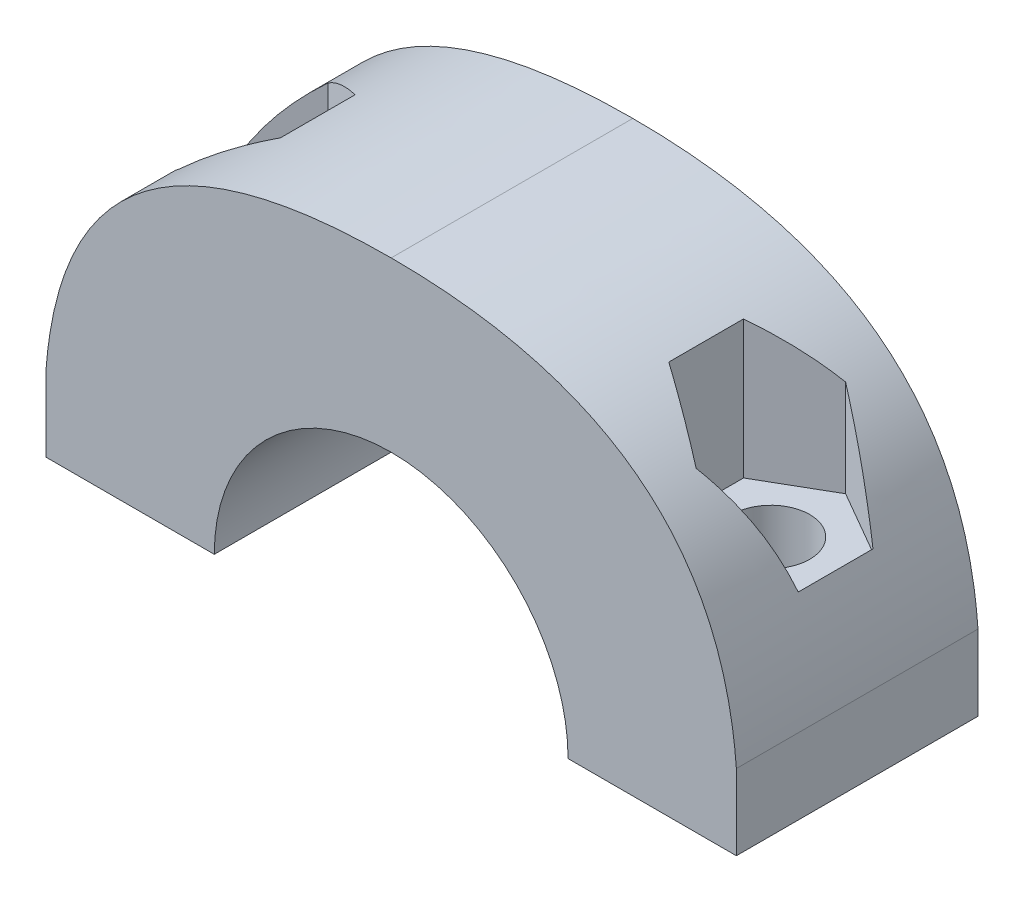
ISO-10303-21;
HEADER;
FILE_DESCRIPTION(('STEP AP214'),'2;1');
FILE_NAME('part.step','',(''),(''),'','','');
FILE_SCHEMA(('AUTOMOTIVE_DESIGN { 1 0 10303 214 1 1 1 1 }'));
ENDSEC;
DATA;
#1=APPLICATION_CONTEXT('core data for automotive mechanical design processes');
#2=APPLICATION_PROTOCOL_DEFINITION('international standard','automotive_design',2000,#1);
#3=PRODUCT_CONTEXT('',#1,'mechanical');
#4=PRODUCT('Part','Part','',(#3));
#5=PRODUCT_RELATED_PRODUCT_CATEGORY('part','',(#4));
#6=PRODUCT_DEFINITION_FORMATION('','',#4);
#7=PRODUCT_DEFINITION_CONTEXT('part definition',#1,'design');
#8=PRODUCT_DEFINITION('design','',#6,#7);
#9=PRODUCT_DEFINITION_SHAPE('','',#8);
#10=(LENGTH_UNIT() NAMED_UNIT(*) SI_UNIT(.MILLI.,.METRE.));
#11=(NAMED_UNIT(*) PLANE_ANGLE_UNIT() SI_UNIT($,.RADIAN.));
#12=(NAMED_UNIT(*) SI_UNIT($,.STERADIAN.) SOLID_ANGLE_UNIT());
#13=UNCERTAINTY_MEASURE_WITH_UNIT(LENGTH_MEASURE(1.E-05),#10,'distance_accuracy_value','');
#14=(GEOMETRIC_REPRESENTATION_CONTEXT(3) GLOBAL_UNCERTAINTY_ASSIGNED_CONTEXT((#13)) GLOBAL_UNIT_ASSIGNED_CONTEXT((#10,
#11,#12)) REPRESENTATION_CONTEXT('',''));
#15=CARTESIAN_POINT('',(0.,0.,0.));
#16=DIRECTION('',(0.,0.,1.));
#17=DIRECTION('',(1.,0.,0.));
#18=AXIS2_PLACEMENT_3D('',#15,#16,#17);
#19=CARTESIAN_POINT('',(-15.,35.,0.));
#20=DIRECTION('',(0.,-1.,0.));
#21=DIRECTION('',(1.,0.,0.));
#22=AXIS2_PLACEMENT_3D('',#19,#20,#21);
#23=CYLINDRICAL_SURFACE('',#22,2.25);
#24=CARTESIAN_POINT('',(-15.,0.,0.));
#25=DIRECTION('',(0.,-1.,0.));
#26=DIRECTION('',(-1.,0.,0.));
#27=AXIS2_PLACEMENT_3D('',#24,#25,#26);
#28=CIRCLE('',#27,2.25);
#29=CARTESIAN_POINT('',(-17.25,0.,0.));
#30=VERTEX_POINT('',#29);
#31=EDGE_CURVE('E387',#30,#30,#28,.T.);
#32=ORIENTED_EDGE('',*,*,#31,.T.);
#33=EDGE_LOOP('',(#32));
#34=FACE_BOUND('',#33,.T.);
#35=CARTESIAN_POINT('',(-15.,10.,0.));
#36=DIRECTION('',(0.,1.,0.));
#37=DIRECTION('',(0.,0.,1.));
#38=AXIS2_PLACEMENT_3D('',#35,#36,#37);
#39=CIRCLE('',#38,2.25);
#40=CARTESIAN_POINT('',(-15.,10.,2.25));
#41=VERTEX_POINT('',#40);
#42=EDGE_CURVE('E384',#41,#41,#39,.F.);
#43=ORIENTED_EDGE('',*,*,#42,.F.);
#44=EDGE_LOOP('',(#43));
#45=FACE_BOUND('',#44,.T.);
#46=ADVANCED_FACE('F43',(#34,#45),#23,.F.);
#47=CARTESIAN_POINT('',(-20.,0.,7.));
#48=DIRECTION('',(1.,0.,0.));
#49=DIRECTION('',(0.,0.,-1.));
#50=AXIS2_PLACEMENT_3D('',#47,#48,#49);
#51=PLANE('',#50);
#52=DIRECTION('',(0.,0.,1.));
#53=VECTOR('',#52,1.);
#54=CARTESIAN_POINT('',(-20.,4.37823737090322,-7.001));
#55=LINE('',#54,#53);
#56=CARTESIAN_POINT('',(-20.,4.37823737090322,-7.));
#57=VERTEX_POINT('',#56);
#58=CARTESIAN_POINT('',(-20.,4.37823737090322,7.));
#59=VERTEX_POINT('',#58);
#60=EDGE_CURVE('E71',#57,#59,#55,.T.);
#61=ORIENTED_EDGE('',*,*,#60,.F.);
#62=DIRECTION('',(0.,-1.,0.));
#63=VECTOR('',#62,1.);
#64=CARTESIAN_POINT('',(-20.,0.,-7.));
#65=LINE('',#64,#63);
#66=CARTESIAN_POINT('',(-20.,0.,-7.));
#67=VERTEX_POINT('',#66);
#68=EDGE_CURVE('E378',#57,#67,#65,.T.);
#69=ORIENTED_EDGE('',*,*,#68,.T.);
#70=DIRECTION('',(0.,0.,1.));
#71=VECTOR('',#70,1.);
#72=CARTESIAN_POINT('',(-20.,0.,-9.82842712474619));
#73=LINE('',#72,#71);
#74=CARTESIAN_POINT('',(-20.,0.,7.));
#75=VERTEX_POINT('',#74);
#76=EDGE_CURVE('E207',#67,#75,#73,.T.);
#77=ORIENTED_EDGE('',*,*,#76,.T.);
#78=DIRECTION('',(0.,-1.,0.));
#79=VECTOR('',#78,1.);
#80=CARTESIAN_POINT('',(-20.,0.,7.));
#81=LINE('',#80,#79);
#82=EDGE_CURVE('E374',#59,#75,#81,.T.);
#83=ORIENTED_EDGE('',*,*,#82,.F.);
#84=EDGE_LOOP('',(#61,#69,#77,#83));
#85=FACE_BOUND('',#84,.T.);
#86=ADVANCED_FACE('F45',(#85),#51,.F.);
#87=CARTESIAN_POINT('',(0.,0.,-7.));
#88=DIRECTION('',(0.,0.,1.));
#89=DIRECTION('',(1.,0.,0.));
#90=AXIS2_PLACEMENT_3D('',#87,#88,#89);
#91=PLANE('',#90);
#92=CARTESIAN_POINT('',(0.,20.,-7.));
#93=CARTESIAN_POINT('',(-21.3364589510658,20.,-7.));
#94=CARTESIAN_POINT('',(-20.,-0.0763553500838322,-7.));
#95=B_SPLINE_CURVE_WITH_KNOTS('',2,(#92,#93,#94),.UNSPECIFIED.,.F.,.F.,(3,3),(0.,1.),.UNSPECIFIED.);
#96=CARTESIAN_POINT('',(0.,20.,-7.));
#97=VERTEX_POINT('',#96);
#98=EDGE_CURVE('E496',#57,#97,#95,.F.);
#99=ORIENTED_EDGE('',*,*,#98,.T.);
#100=CARTESIAN_POINT('',(0.,20.,-7.));
#101=CARTESIAN_POINT('',(21.3364589510658,20.,-7.));
#102=CARTESIAN_POINT('',(20.,-0.0763553500838322,-7.));
#103=B_SPLINE_CURVE_WITH_KNOTS('',2,(#100,#101,#102),.UNSPECIFIED.,.F.,.F.,(3,3),(0.,1.),.UNSPECIFIED.);
#104=CARTESIAN_POINT('',(20.,4.37823737090339,-7.));
#105=VERTEX_POINT('',#104);
#106=EDGE_CURVE('E187',#97,#105,#103,.T.);
#107=ORIENTED_EDGE('',*,*,#106,.T.);
#108=DIRECTION('',(0.,1.,0.));
#109=VECTOR('',#108,1.);
#110=CARTESIAN_POINT('',(20.,0.,-7.));
#111=LINE('',#110,#109);
#112=CARTESIAN_POINT('',(20.,0.,-7.));
#113=VERTEX_POINT('',#112);
#114=EDGE_CURVE('E181',#113,#105,#111,.T.);
#115=ORIENTED_EDGE('',*,*,#114,.F.);
#116=DIRECTION('',(1.,0.,0.));
#117=VECTOR('',#116,1.);
#118=CARTESIAN_POINT('',(10.25,0.,-7.));
#119=LINE('',#118,#117);
#120=CARTESIAN_POINT('',(10.25,0.,-7.));
#121=VERTEX_POINT('',#120);
#122=EDGE_CURVE('E186',#121,#113,#119,.T.);
#123=ORIENTED_EDGE('',*,*,#122,.F.);
#124=CARTESIAN_POINT('',(0.,0.,-7.));
#125=DIRECTION('',(0.,0.,-1.));
#126=DIRECTION('',(1.,0.,0.));
#127=AXIS2_PLACEMENT_3D('',#124,#125,#126);
#128=CIRCLE('',#127,10.25);
#129=CARTESIAN_POINT('',(-10.25,0.,-7.));
#130=VERTEX_POINT('',#129);
#131=EDGE_CURVE('E372',#130,#121,#128,.T.);
#132=ORIENTED_EDGE('',*,*,#131,.F.);
#133=DIRECTION('',(1.,0.,0.));
#134=VECTOR('',#133,1.);
#135=CARTESIAN_POINT('',(-20.,0.,-7.));
#136=LINE('',#135,#134);
#137=EDGE_CURVE('E375',#67,#130,#136,.T.);
#138=ORIENTED_EDGE('',*,*,#137,.F.);
#139=ORIENTED_EDGE('',*,*,#68,.F.);
#140=EDGE_LOOP('',(#99,#107,#115,#123,#132,#138,#139));
#141=FACE_BOUND('',#140,.T.);
#142=ADVANCED_FACE('F184',(#141),#91,.F.);
#143=CARTESIAN_POINT('',(0.,0.,7.));
#144=DIRECTION('',(0.,0.,1.));
#145=DIRECTION('',(1.,0.,0.));
#146=AXIS2_PLACEMENT_3D('',#143,#144,#145);
#147=PLANE('',#146);
#148=CARTESIAN_POINT('',(0.,0.,7.));
#149=DIRECTION('',(0.,0.,-1.));
#150=DIRECTION('',(1.,0.,0.));
#151=AXIS2_PLACEMENT_3D('',#148,#149,#150);
#152=CIRCLE('',#151,10.25);
#153=CARTESIAN_POINT('',(-10.25,0.,7.));
#154=VERTEX_POINT('',#153);
#155=CARTESIAN_POINT('',(10.25,0.,7.));
#156=VERTEX_POINT('',#155);
#157=EDGE_CURVE('E363',#154,#156,#152,.T.);
#158=ORIENTED_EDGE('',*,*,#157,.T.);
#159=DIRECTION('',(1.,0.,0.));
#160=VECTOR('',#159,1.);
#161=CARTESIAN_POINT('',(10.25,0.,7.));
#162=LINE('',#161,#160);
#163=CARTESIAN_POINT('',(20.,0.,7.));
#164=VERTEX_POINT('',#163);
#165=EDGE_CURVE('E191',#156,#164,#162,.T.);
#166=ORIENTED_EDGE('',*,*,#165,.T.);
#167=DIRECTION('',(0.,1.,0.));
#168=VECTOR('',#167,1.);
#169=CARTESIAN_POINT('',(20.,0.,7.));
#170=LINE('',#169,#168);
#171=CARTESIAN_POINT('',(20.,4.37823737090339,7.));
#172=VERTEX_POINT('',#171);
#173=EDGE_CURVE('E206',#164,#172,#170,.T.);
#174=ORIENTED_EDGE('',*,*,#173,.T.);
#175=CARTESIAN_POINT('',(0.,20.,7.));
#176=CARTESIAN_POINT('',(21.3364589510658,20.,7.));
#177=CARTESIAN_POINT('',(20.,-0.0763553500838322,7.));
#178=B_SPLINE_CURVE_WITH_KNOTS('',2,(#175,#176,#177),.UNSPECIFIED.,.F.,.F.,(3,3),(0.,1.),.UNSPECIFIED.);
#179=CARTESIAN_POINT('',(0.,20.,7.));
#180=VERTEX_POINT('',#179);
#181=EDGE_CURVE('E251',#180,#172,#178,.T.);
#182=ORIENTED_EDGE('',*,*,#181,.F.);
#183=CARTESIAN_POINT('',(0.,20.,7.));
#184=CARTESIAN_POINT('',(-21.3364589510658,20.,7.));
#185=CARTESIAN_POINT('',(-20.,-0.0763553500838322,7.));
#186=B_SPLINE_CURVE_WITH_KNOTS('',2,(#183,#184,#185),.UNSPECIFIED.,.F.,.F.,(3,3),(0.,1.),.UNSPECIFIED.);
#187=EDGE_CURVE('E509',#180,#59,#186,.T.);
#188=ORIENTED_EDGE('',*,*,#187,.T.);
#189=ORIENTED_EDGE('',*,*,#82,.T.);
#190=DIRECTION('',(1.,0.,0.));
#191=VECTOR('',#190,1.);
#192=CARTESIAN_POINT('',(-20.,0.,7.));
#193=LINE('',#192,#191);
#194=EDGE_CURVE('E365',#75,#154,#193,.T.);
#195=ORIENTED_EDGE('',*,*,#194,.T.);
#196=EDGE_LOOP('',(#158,#166,#174,#182,#188,#189,#195));
#197=FACE_BOUND('',#196,.T.);
#198=ADVANCED_FACE('F361',(#197),#147,.T.);
#199=CARTESIAN_POINT('',(-20.,0.,7.));
#200=DIRECTION('',(0.,1.,0.));
#201=DIRECTION('',(-1.,0.,0.));
#202=AXIS2_PLACEMENT_3D('',#199,#200,#201);
#203=PLANE('',#202);
#204=ORIENTED_EDGE('',*,*,#31,.F.);
#205=EDGE_LOOP('',(#204));
#206=FACE_BOUND('',#205,.T.);
#207=ORIENTED_EDGE('',*,*,#194,.F.);
#208=ORIENTED_EDGE('',*,*,#76,.F.);
#209=ORIENTED_EDGE('',*,*,#137,.T.);
#210=DIRECTION('',(0.,0.,-1.));
#211=VECTOR('',#210,1.);
#212=CARTESIAN_POINT('',(-10.25,0.,7.));
#213=LINE('',#212,#211);
#214=EDGE_CURVE('E369',#154,#130,#213,.T.);
#215=ORIENTED_EDGE('',*,*,#214,.F.);
#216=EDGE_LOOP('',(#207,#208,#209,#215));
#217=FACE_BOUND('',#216,.T.);
#218=ADVANCED_FACE('F448',(#206,#217),#203,.F.);
#219=CARTESIAN_POINT('',(0.,0.,7.));
#220=DIRECTION('',(0.,0.,-1.));
#221=DIRECTION('',(-1.,0.,0.));
#222=AXIS2_PLACEMENT_3D('',#219,#220,#221);
#223=CYLINDRICAL_SURFACE('',#222,10.25);
#224=ORIENTED_EDGE('',*,*,#131,.T.);
#225=DIRECTION('',(0.,0.,-1.));
#226=VECTOR('',#225,1.);
#227=CARTESIAN_POINT('',(10.25,0.,7.));
#228=LINE('',#227,#226);
#229=EDGE_CURVE('E200',#156,#121,#228,.T.);
#230=ORIENTED_EDGE('',*,*,#229,.F.);
#231=ORIENTED_EDGE('',*,*,#157,.F.);
#232=ORIENTED_EDGE('',*,*,#214,.T.);
#233=EDGE_LOOP('',(#224,#230,#231,#232));
#234=FACE_BOUND('',#233,.T.);
#235=ADVANCED_FACE('F371',(#234),#223,.F.);
#236=CARTESIAN_POINT('',(0.,20.,-7.001));
#237=CARTESIAN_POINT('',(-21.3364589510658,20.,-7.001));
#238=CARTESIAN_POINT('',(-20.,-0.0763553500838322,-7.001));
#239=B_SPLINE_CURVE_WITH_KNOTS('',2,(#236,#237,#238),.UNSPECIFIED.,.F.,.F.,(3,3),(0.,1.),.UNSPECIFIED.);
#240=DIRECTION('',(0.,0.,1.));
#241=VECTOR('',#240,1.);
#242=SURFACE_OF_LINEAR_EXTRUSION('',#239,#241);
#243=CARTESIAN_POINT('',(-15.,15.6071851133788,4.3301270189222));
#244=CARTESIAN_POINT('',(-14.8854483036064,15.7074375849572,4.26399056617323));
#245=CARTESIAN_POINT('',(-14.7694756690178,15.8055158896841,4.19703373437486));
#246=CARTESIAN_POINT('',(-14.5352777899895,15.997038518228,4.06181952587421));
#247=CARTESIAN_POINT('',(-14.4170614002219,16.0904972742878,3.99356726141928));
#248=CARTESIAN_POINT('',(-14.1784751181328,16.2729522616809,3.85581940723017));
#249=CARTESIAN_POINT('',(-14.0581109358645,16.3619584585819,3.78632711419682));
#250=CARTESIAN_POINT('',(-13.8153212116759,16.5356750743019,3.64615240158001));
#251=CARTESIAN_POINT('',(-13.6928988912952,16.6203915005076,3.57547184195344));
#252=CARTESIAN_POINT('',(-13.4460798328883,16.7856846333991,3.43297079214104));
#253=CARTESIAN_POINT('',(-13.3216843777116,16.8662638962464,3.36115104260886));
#254=CARTESIAN_POINT('',(-13.0710706070805,17.0233868431527,3.21645911467235));
#255=CARTESIAN_POINT('',(-12.944853139303,17.0999323314104,3.14358742567459));
#256=CARTESIAN_POINT('',(-12.6905854561505,17.2491868299323,2.99678591036024));
#257=CARTESIAN_POINT('',(-12.5625336805988,17.3218922933087,2.92285518327525));
#258=CARTESIAN_POINT('',(-12.3046528343486,17.4636063500637,2.77396760727385));
#259=CARTESIAN_POINT('',(-12.1748212303311,17.5326087920837,2.69900929574501));
#260=CARTESIAN_POINT('',(-11.9134331293735,17.6670471732661,2.54809680529423));
#261=CARTESIAN_POINT('',(-11.7818734169363,17.7324747664504,2.47214076990405));
#262=CARTESIAN_POINT('',(-11.5170754572507,17.8598861969901,2.31925959659876));
#263=CARTESIAN_POINT('',(-11.3838335374536,17.9218598623611,2.24233233833654));
#264=CARTESIAN_POINT('',(-11.25,17.9820685608056,2.16506350946109));
#265=B_SPLINE_CURVE_WITH_KNOTS('',3,(#243,#244,#245,#246,#247,#248,#249,#250,#251,#252,#253,
#254,#255,#256,#257,#258,#259,#260,#261,#262,#263,#264),.UNSPECIFIED.,.F.,.F.,(4,2,2,2,2,2,2,2,
2,2,4),(0.,0.49788516570358,0.994101277948624,1.48915192851902,1.98348896718069,
2.47751680877294,2.97132177617924,3.46557515038524,3.96062564771629,4.45678643569842,
4.95433862441397),.UNSPECIFIED.);
#266=CARTESIAN_POINT('',(-15.,15.6071851133788,4.33012701892219));
#267=VERTEX_POINT('',#266);
#268=CARTESIAN_POINT('',(-11.25,17.9820685608055,2.1650635094611));
#269=VERTEX_POINT('',#268);
#270=EDGE_CURVE('E11',#267,#269,#265,.T.);
#271=ORIENTED_EDGE('',*,*,#270,.F.);
#272=CARTESIAN_POINT('',(-18.75,10.1915912491445,2.1650635094611));
#273=CARTESIAN_POINT('',(-18.6787979909147,10.373646913082,2.20617200857332));
#274=CARTESIAN_POINT('',(-18.6043795307877,10.5540329126819,2.24913752656032));
#275=CARTESIAN_POINT('',(-18.4490952844584,10.9110862188874,2.33879092797949));
#276=CARTESIAN_POINT('',(-18.3682288824466,11.0877531682644,2.38547916694935));
#277=CARTESIAN_POINT('',(-18.2000111720747,11.4370303892306,2.48259970731507));
#278=CARTESIAN_POINT('',(-18.1126570435292,11.6096388531818,2.53303363694562));
#279=CARTESIAN_POINT('',(-17.9315694398031,11.9503108062343,2.63758461370377));
#280=CARTESIAN_POINT('',(-17.8378362338114,12.1183744867021,2.69170150541509));
#281=CARTESIAN_POINT('',(-17.551257530142,12.6082727376552,2.85715779712267));
#282=CARTESIAN_POINT('',(-17.3494679429998,12.9232177402289,2.97366106957888));
#283=CARTESIAN_POINT('',(-16.923250213962,13.531686349695,3.21973799017221));
#284=CARTESIAN_POINT('',(-16.698834289185,13.8252213709242,3.34930458475268));
#285=CARTESIAN_POINT('',(-16.3515629493268,14.242475001771,3.54980178630165));
#286=CARTESIAN_POINT('',(-16.2366186610412,14.3750846287157,3.61616490208516));
#287=CARTESIAN_POINT('',(-16.0022528278592,14.6348917846541,3.75147607896162));
#288=CARTESIAN_POINT('',(-15.8828319880286,14.7620901592493,3.82042373298469));
#289=CARTESIAN_POINT('',(-15.6385291354359,15.0122740906797,3.96147205069285));
#290=CARTESIAN_POINT('',(-15.5136035965153,15.135202885123,4.03359784421735));
#291=CARTESIAN_POINT('',(-15.2597374826033,15.3754292718763,4.18016751342253));
#292=CARTESIAN_POINT('',(-15.1307965830237,15.4927264069835,4.25461157650436));
#293=CARTESIAN_POINT('',(-15.,15.6071851133788,4.33012701892219));
#294=B_SPLINE_CURVE_WITH_KNOTS('',3,(#272,#273,#274,#275,#276,#277,#278,#279,#280,#281,#282,
#283,#284,#285,#286,#287,#288,#289,#290,#291,#292,#293),.UNSPECIFIED.,.F.,.F.,(4,2,2,2,2,2,2,2,
2,2,4),(0.,0.5992469071738,1.19855111400897,1.79811737787623,2.3976583564856,3.57141446422683,
4.74454016095587,5.30728005967803,5.86993169512034,6.43836841974762,7.00685121478777),.UNSPECIFIED.);
#295=CARTESIAN_POINT('',(-18.75,10.1915912491445,2.1650635094611));
#296=VERTEX_POINT('',#295);
#297=EDGE_CURVE('E57',#296,#267,#294,.T.);
#298=ORIENTED_EDGE('',*,*,#297,.F.);
#299=DIRECTION('',(0.,0.,1.));
#300=VECTOR('',#299,1.);
#301=CARTESIAN_POINT('',(-18.75,10.1915912491445,0.));
#302=LINE('',#301,#300);
#303=CARTESIAN_POINT('',(-18.75,10.1915912491445,-2.1650635094611));
#304=VERTEX_POINT('',#303);
#305=EDGE_CURVE('E459',#304,#296,#302,.T.);
#306=ORIENTED_EDGE('',*,*,#305,.F.);
#307=CARTESIAN_POINT('',(-15.,15.6071851133788,-4.33012701892219));
#308=CARTESIAN_POINT('',(-15.1378757499793,15.4865329817572,-4.25052441755693));
#309=CARTESIAN_POINT('',(-15.2736892149048,15.3627250987194,-4.17211247702259));
#310=CARTESIAN_POINT('',(-15.540863320826,15.1088274306084,-4.01785943504848));
#311=CARTESIAN_POINT('',(-15.6722234405723,14.9787369144647,-3.94201863455219));
#312=CARTESIAN_POINT('',(-15.9302158968628,14.7122433071259,-3.793066620464));
#313=CARTESIAN_POINT('',(-16.0568450364279,14.5758360819691,-3.71995725264885));
#314=CARTESIAN_POINT('',(-16.3049384814253,14.2969257229649,-3.57672043539542));
#315=CARTESIAN_POINT('',(-16.4264030313741,14.1544228783555,-3.50659284478548));
#316=CARTESIAN_POINT('',(-16.7775752812966,13.7241291154111,-3.30384345176075));
#317=CARTESIAN_POINT('',(-16.9995810414709,13.4278572792646,-3.17566836636251));
#318=CARTESIAN_POINT('',(-17.4205127287113,12.814489053683,-2.9326433434238));
#319=CARTESIAN_POINT('',(-17.6194526496645,12.4974054754221,-2.81778532650889));
#320=CARTESIAN_POINT('',(-17.8958341202465,12.0147081519721,-2.65821641006936));
#321=CARTESIAN_POINT('',(-17.9826283341353,11.8561386562615,-2.60810574731656));
#322=CARTESIAN_POINT('',(-18.1505734148144,11.5350816044261,-2.51114260977739));
#323=CARTESIAN_POINT('',(-18.2317250780295,11.3725946056201,-2.46428967517501));
#324=CARTESIAN_POINT('',(-18.3891556157586,11.0423144200723,-2.37339711183846));
#325=CARTESIAN_POINT('',(-18.4653753643805,10.8744837204886,-2.32939161945402));
#326=CARTESIAN_POINT('',(-18.6120278667466,10.5354666460872,-2.2447217577356));
#327=CARTESIAN_POINT('',(-18.6824601637587,10.3642800077445,-2.20405765209602));
#328=CARTESIAN_POINT('',(-18.75,10.1915912491445,-2.16506350946109));
#329=B_SPLINE_CURVE_WITH_KNOTS('',3,(#307,#308,#309,#310,#311,#312,#313,#314,#315,#316,#317,
#318,#319,#320,#321,#322,#323,#324,#325,#326,#327,#328),.UNSPECIFIED.,.F.,.F.,(4,2,2,2,2,2,2,2,
2,2,4),(0.,0.5992460680801,1.19856203546709,1.7982759260279,2.39796139156329,3.57177478451942,
4.74487226466955,5.30750431310959,5.87005678627587,6.43843162259569,7.00685127072936),.UNSPECIFIED.);
#330=CARTESIAN_POINT('',(-15.,15.6071851133788,-4.33012701892219));
#331=VERTEX_POINT('',#330);
#332=EDGE_CURVE('E397',#331,#304,#329,.T.);
#333=ORIENTED_EDGE('',*,*,#332,.F.);
#334=CARTESIAN_POINT('',(-11.25,17.9820685608055,-2.1650635094611));
#335=CARTESIAN_POINT('',(-11.3838335374536,17.9218598623611,-2.24233233833654));
#336=CARTESIAN_POINT('',(-11.5170754572508,17.8598861969901,-2.31925959659876));
#337=CARTESIAN_POINT('',(-11.7818734169363,17.7324747664504,-2.47214076990405));
#338=CARTESIAN_POINT('',(-11.9134331293736,17.6670471732661,-2.54809680529423));
#339=CARTESIAN_POINT('',(-12.1748212303311,17.5326087920837,-2.69900929574502));
#340=CARTESIAN_POINT('',(-12.3046528343486,17.4636063500637,-2.77396760727385));
#341=CARTESIAN_POINT('',(-12.5625336805988,17.3218922933087,-2.92285518327525));
#342=CARTESIAN_POINT('',(-12.6905854561505,17.2491868299322,-2.99678591036024));
#343=CARTESIAN_POINT('',(-12.9448531393031,17.0999323314104,-3.14358742567459));
#344=CARTESIAN_POINT('',(-13.0710706070805,17.0233868431527,-3.21645911467235));
#345=CARTESIAN_POINT('',(-13.3216843777117,16.8662638962463,-3.36115104260886));
#346=CARTESIAN_POINT('',(-13.4460798328883,16.7856846333991,-3.43297079214104));
#347=CARTESIAN_POINT('',(-13.6928988912952,16.6203915005076,-3.57547184195344));
#348=CARTESIAN_POINT('',(-13.8153212116759,16.5356750743019,-3.64615240158001));
#349=CARTESIAN_POINT('',(-14.0581109358645,16.3619584585819,-3.78632711419682));
#350=CARTESIAN_POINT('',(-14.1784751181328,16.2729522616809,-3.85581940723017));
#351=CARTESIAN_POINT('',(-14.4170614002219,16.0904972742878,-3.99356726141928));
#352=CARTESIAN_POINT('',(-14.5352777899895,15.997038518228,-4.06181952587421));
#353=CARTESIAN_POINT('',(-14.7694756690178,15.805515889684,-4.19703373437486));
#354=CARTESIAN_POINT('',(-14.8854483036064,15.7074375849572,-4.26399056617323));
#355=CARTESIAN_POINT('',(-15.,15.6071851133788,-4.33012701892219));
#356=B_SPLINE_CURVE_WITH_KNOTS('',3,(#334,#335,#336,#337,#338,#339,#340,#341,#342,#343,#344,
#345,#346,#347,#348,#349,#350,#351,#352,#353,#354,#355),.UNSPECIFIED.,.F.,.F.,(4,2,2,2,2,2,2,2,
2,2,4),(0.,0.497552188715552,0.993712976697677,1.48876347402873,1.98301684823473,
2.47682181564103,2.97084965723328,3.46518669589495,3.96023734646535,4.45645345871039,
4.95433862441397),.UNSPECIFIED.);
#357=CARTESIAN_POINT('',(-11.25,17.9820685608055,-2.1650635094611));
#358=VERTEX_POINT('',#357);
#359=EDGE_CURVE('E390',#358,#331,#356,.T.);
#360=ORIENTED_EDGE('',*,*,#359,.F.);
#361=DIRECTION('',(0.,0.,1.));
#362=VECTOR('',#361,1.);
#363=CARTESIAN_POINT('',(-11.25,17.9820685608055,0.));
#364=LINE('',#363,#362);
#365=EDGE_CURVE('E383',#269,#358,#364,.F.);
#366=ORIENTED_EDGE('',*,*,#365,.F.);
#367=EDGE_LOOP('',(#271,#298,#306,#333,#360,#366));
#368=FACE_BOUND('',#367,.T.);
#369=ORIENTED_EDGE('',*,*,#60,.T.);
#370=ORIENTED_EDGE('',*,*,#187,.F.);
#371=DIRECTION('',(0.,0.,-1.));
#372=VECTOR('',#371,1.);
#373=CARTESIAN_POINT('',(0.,20.,7.));
#374=LINE('',#373,#372);
#375=EDGE_CURVE('E347',#180,#97,#374,.T.);
#376=ORIENTED_EDGE('',*,*,#375,.T.);
#377=ORIENTED_EDGE('',*,*,#98,.F.);
#378=EDGE_LOOP('',(#369,#370,#376,#377));
#379=FACE_BOUND('',#378,.T.);
#380=ADVANCED_FACE('F404',(#368,#379),#242,.T.);
#381=CARTESIAN_POINT('',(0.,10.,0.));
#382=DIRECTION('',(0.,1.,0.));
#383=DIRECTION('',(0.,0.,1.));
#384=AXIS2_PLACEMENT_3D('',#381,#382,#383);
#385=PLANE('',#384);
#386=DIRECTION('',(0.866025403784438,0.,-0.500000000000001));
#387=VECTOR('',#386,1.);
#388=CARTESIAN_POINT('',(-15.,10.,4.33012701892219));
#389=LINE('',#388,#387);
#390=CARTESIAN_POINT('',(-15.,10.,4.33012701892219));
#391=VERTEX_POINT('',#390);
#392=CARTESIAN_POINT('',(-11.25,10.,2.1650635094611));
#393=VERTEX_POINT('',#392);
#394=EDGE_CURVE('E328',#391,#393,#389,.T.);
#395=ORIENTED_EDGE('',*,*,#394,.T.);
#396=DIRECTION('',(0.,0.,-1.));
#397=VECTOR('',#396,1.);
#398=CARTESIAN_POINT('',(-11.25,10.,2.1650635094611));
#399=LINE('',#398,#397);
#400=CARTESIAN_POINT('',(-11.25,10.,-2.1650635094611));
#401=VERTEX_POINT('',#400);
#402=EDGE_CURVE('E736',#393,#401,#399,.T.);
#403=ORIENTED_EDGE('',*,*,#402,.T.);
#404=DIRECTION('',(-0.866025403784439,0.,-0.5));
#405=VECTOR('',#404,1.);
#406=CARTESIAN_POINT('',(-11.25,10.,-2.1650635094611));
#407=LINE('',#406,#405);
#408=CARTESIAN_POINT('',(-15.,10.,-4.33012701892219));
#409=VERTEX_POINT('',#408);
#410=EDGE_CURVE('E731',#401,#409,#407,.T.);
#411=ORIENTED_EDGE('',*,*,#410,.T.);
#412=DIRECTION('',(-0.866025403784438,0.,0.5));
#413=VECTOR('',#412,1.);
#414=CARTESIAN_POINT('',(-15.,10.,-4.33012701892219));
#415=LINE('',#414,#413);
#416=CARTESIAN_POINT('',(-18.75,10.,-2.1650635094611));
#417=VERTEX_POINT('',#416);
#418=EDGE_CURVE('E730',#409,#417,#415,.T.);
#419=ORIENTED_EDGE('',*,*,#418,.T.);
#420=DIRECTION('',(0.,0.,1.));
#421=VECTOR('',#420,1.);
#422=CARTESIAN_POINT('',(-18.75,10.,-2.1650635094611));
#423=LINE('',#422,#421);
#424=CARTESIAN_POINT('',(-18.75,10.,2.1650635094611));
#425=VERTEX_POINT('',#424);
#426=EDGE_CURVE('E473',#417,#425,#423,.T.);
#427=ORIENTED_EDGE('',*,*,#426,.T.);
#428=DIRECTION('',(0.866025403784439,0.,0.5));
#429=VECTOR('',#428,1.);
#430=CARTESIAN_POINT('',(-18.75,10.,2.1650635094611));
#431=LINE('',#430,#429);
#432=EDGE_CURVE('E487',#425,#391,#431,.T.);
#433=ORIENTED_EDGE('',*,*,#432,.T.);
#434=EDGE_LOOP('',(#395,#403,#411,#419,#427,#433));
#435=FACE_BOUND('',#434,.T.);
#436=ORIENTED_EDGE('',*,*,#42,.T.);
#437=EDGE_LOOP('',(#436));
#438=FACE_BOUND('',#437,.T.);
#439=ADVANCED_FACE('F423',(#435,#438),#385,.T.);
#440=CARTESIAN_POINT('',(-15.,10.,4.33012701892219));
#441=DIRECTION('',(0.500000000000001,0.,0.866025403784438));
#442=DIRECTION('',(0.866025403784438,0.,-0.500000000000001));
#443=AXIS2_PLACEMENT_3D('',#440,#441,#442);
#444=PLANE('',#443);
#445=ORIENTED_EDGE('',*,*,#270,.T.);
#446=DIRECTION('',(0.,1.,0.));
#447=VECTOR('',#446,1.);
#448=CARTESIAN_POINT('',(-11.25,10.,2.1650635094611));
#449=LINE('',#448,#447);
#450=EDGE_CURVE('E64',#393,#269,#449,.T.);
#451=ORIENTED_EDGE('',*,*,#450,.F.);
#452=ORIENTED_EDGE('',*,*,#394,.F.);
#453=DIRECTION('',(0.,1.,0.));
#454=VECTOR('',#453,1.);
#455=CARTESIAN_POINT('',(-15.,10.,4.33012701892219));
#456=LINE('',#455,#454);
#457=EDGE_CURVE('E388',#391,#267,#456,.T.);
#458=ORIENTED_EDGE('',*,*,#457,.T.);
#459=EDGE_LOOP('',(#445,#451,#452,#458));
#460=FACE_BOUND('',#459,.T.);
#461=ADVANCED_FACE('F419',(#460),#444,.F.);
#462=CARTESIAN_POINT('',(-18.75,10.,2.1650635094611));
#463=DIRECTION('',(-0.5,0.,0.866025403784439));
#464=DIRECTION('',(0.866025403784439,0.,0.5));
#465=AXIS2_PLACEMENT_3D('',#462,#463,#464);
#466=PLANE('',#465);
#467=ORIENTED_EDGE('',*,*,#297,.T.);
#468=ORIENTED_EDGE('',*,*,#457,.F.);
#469=ORIENTED_EDGE('',*,*,#432,.F.);
#470=DIRECTION('',(0.,1.,0.));
#471=VECTOR('',#470,1.);
#472=CARTESIAN_POINT('',(-18.75,10.,2.1650635094611));
#473=LINE('',#472,#471);
#474=EDGE_CURVE('E475',#425,#296,#473,.T.);
#475=ORIENTED_EDGE('',*,*,#474,.T.);
#476=EDGE_LOOP('',(#467,#468,#469,#475));
#477=FACE_BOUND('',#476,.T.);
#478=ADVANCED_FACE('F422',(#477),#466,.F.);
#479=CARTESIAN_POINT('',(-18.75,10.,-2.1650635094611));
#480=DIRECTION('',(-1.,0.,0.));
#481=DIRECTION('',(0.,0.,1.));
#482=AXIS2_PLACEMENT_3D('',#479,#480,#481);
#483=PLANE('',#482);
#484=ORIENTED_EDGE('',*,*,#305,.T.);
#485=ORIENTED_EDGE('',*,*,#474,.F.);
#486=ORIENTED_EDGE('',*,*,#426,.F.);
#487=DIRECTION('',(0.,1.,0.));
#488=VECTOR('',#487,1.);
#489=CARTESIAN_POINT('',(-18.75,10.,-2.1650635094611));
#490=LINE('',#489,#488);
#491=EDGE_CURVE('E468',#417,#304,#490,.T.);
#492=ORIENTED_EDGE('',*,*,#491,.T.);
#493=EDGE_LOOP('',(#484,#485,#486,#492));
#494=FACE_BOUND('',#493,.T.);
#495=ADVANCED_FACE('F453',(#494),#483,.F.);
#496=CARTESIAN_POINT('',(-15.,10.,-4.33012701892219));
#497=DIRECTION('',(-0.5,0.,-0.866025403784438));
#498=DIRECTION('',(-0.866025403784438,0.,0.5));
#499=AXIS2_PLACEMENT_3D('',#496,#497,#498);
#500=PLANE('',#499);
#501=ORIENTED_EDGE('',*,*,#332,.T.);
#502=ORIENTED_EDGE('',*,*,#491,.F.);
#503=ORIENTED_EDGE('',*,*,#418,.F.);
#504=DIRECTION('',(0.,1.,0.));
#505=VECTOR('',#504,1.);
#506=CARTESIAN_POINT('',(-15.,10.,-4.33012701892219));
#507=LINE('',#506,#505);
#508=EDGE_CURVE('E470',#409,#331,#507,.T.);
#509=ORIENTED_EDGE('',*,*,#508,.T.);
#510=EDGE_LOOP('',(#501,#502,#503,#509));
#511=FACE_BOUND('',#510,.T.);
#512=ADVANCED_FACE('F414',(#511),#500,.F.);
#513=CARTESIAN_POINT('',(-11.25,10.,-2.1650635094611));
#514=DIRECTION('',(0.5,0.,-0.866025403784439));
#515=DIRECTION('',(-0.866025403784439,0.,-0.5));
#516=AXIS2_PLACEMENT_3D('',#513,#514,#515);
#517=PLANE('',#516);
#518=ORIENTED_EDGE('',*,*,#359,.T.);
#519=ORIENTED_EDGE('',*,*,#508,.F.);
#520=ORIENTED_EDGE('',*,*,#410,.F.);
#521=DIRECTION('',(0.,1.,0.));
#522=VECTOR('',#521,1.);
#523=CARTESIAN_POINT('',(-11.25,10.,-2.1650635094611));
#524=LINE('',#523,#522);
#525=EDGE_CURVE('E491',#401,#358,#524,.T.);
#526=ORIENTED_EDGE('',*,*,#525,.T.);
#527=EDGE_LOOP('',(#518,#519,#520,#526));
#528=FACE_BOUND('',#527,.T.);
#529=ADVANCED_FACE('F409',(#528),#517,.F.);
#530=CARTESIAN_POINT('',(-11.25,10.,2.1650635094611));
#531=DIRECTION('',(1.,0.,0.));
#532=DIRECTION('',(0.,0.,-1.));
#533=AXIS2_PLACEMENT_3D('',#530,#531,#532);
#534=PLANE('',#533);
#535=ORIENTED_EDGE('',*,*,#365,.T.);
#536=ORIENTED_EDGE('',*,*,#525,.F.);
#537=ORIENTED_EDGE('',*,*,#402,.F.);
#538=ORIENTED_EDGE('',*,*,#450,.T.);
#539=EDGE_LOOP('',(#535,#536,#537,#538));
#540=FACE_BOUND('',#539,.T.);
#541=ADVANCED_FACE('F413',(#540),#534,.F.);
#542=CARTESIAN_POINT('',(10.25,0.,7.));
#543=DIRECTION('',(0.,1.,0.));
#544=DIRECTION('',(-1.,0.,0.));
#545=AXIS2_PLACEMENT_3D('',#542,#543,#544);
#546=PLANE('',#545);
#547=CARTESIAN_POINT('',(15.,0.,0.));
#548=DIRECTION('',(0.,-1.,0.));
#549=DIRECTION('',(1.,0.,0.));
#550=AXIS2_PLACEMENT_3D('',#547,#548,#549);
#551=CIRCLE('',#550,2.25);
#552=CARTESIAN_POINT('',(17.25,0.,0.));
#553=VERTEX_POINT('',#552);
#554=EDGE_CURVE('E248',#553,#553,#551,.T.);
#555=ORIENTED_EDGE('',*,*,#554,.F.);
#556=EDGE_LOOP('',(#555));
#557=FACE_BOUND('',#556,.T.);
#558=ORIENTED_EDGE('',*,*,#122,.T.);
#559=DIRECTION('',(0.,0.,1.));
#560=VECTOR('',#559,1.);
#561=CARTESIAN_POINT('',(20.,0.,-9.82842712474619));
#562=LINE('',#561,#560);
#563=EDGE_CURVE('E198',#113,#164,#562,.T.);
#564=ORIENTED_EDGE('',*,*,#563,.T.);
#565=ORIENTED_EDGE('',*,*,#165,.F.);
#566=ORIENTED_EDGE('',*,*,#229,.T.);
#567=EDGE_LOOP('',(#558,#564,#565,#566));
#568=FACE_BOUND('',#567,.T.);
#569=ADVANCED_FACE('F196',(#557,#568),#546,.F.);
#570=CARTESIAN_POINT('',(20.,0.,7.));
#571=DIRECTION('',(-1.,0.,0.));
#572=DIRECTION('',(0.,-1.,0.));
#573=AXIS2_PLACEMENT_3D('',#570,#571,#572);
#574=PLANE('',#573);
#575=ORIENTED_EDGE('',*,*,#114,.T.);
#576=DIRECTION('',(0.,0.,1.));
#577=VECTOR('',#576,1.);
#578=CARTESIAN_POINT('',(20.,4.37823737090321,-7.0005));
#579=LINE('',#578,#577);
#580=EDGE_CURVE('E201',#105,#172,#579,.T.);
#581=ORIENTED_EDGE('',*,*,#580,.T.);
#582=ORIENTED_EDGE('',*,*,#173,.F.);
#583=ORIENTED_EDGE('',*,*,#563,.F.);
#584=EDGE_LOOP('',(#575,#581,#582,#583));
#585=FACE_BOUND('',#584,.T.);
#586=ADVANCED_FACE('F204',(#585),#574,.F.);
#587=CARTESIAN_POINT('',(0.,20.,-7.0005));
#588=CARTESIAN_POINT('',(21.3364589510658,20.,-7.0005));
#589=CARTESIAN_POINT('',(20.,-0.0763553500838322,-7.0005));
#590=B_SPLINE_CURVE_WITH_KNOTS('',2,(#587,#588,#589),.UNSPECIFIED.,.F.,.F.,(3,3),(0.,1.),.UNSPECIFIED.);
#591=DIRECTION('',(0.,0.,1.));
#592=VECTOR('',#591,1.);
#593=SURFACE_OF_LINEAR_EXTRUSION('',#590,#592);
#594=DIRECTION('',(0.,0.,1.));
#595=VECTOR('',#594,1.);
#596=CARTESIAN_POINT('',(18.75,10.1915912491445,0.));
#597=LINE('',#596,#595);
#598=CARTESIAN_POINT('',(18.75,10.1915912491445,-2.1650635094611));
#599=VERTEX_POINT('',#598);
#600=CARTESIAN_POINT('',(18.75,10.1915912491445,2.1650635094611));
#601=VERTEX_POINT('',#600);
#602=EDGE_CURVE('E340',#599,#601,#597,.T.);
#603=ORIENTED_EDGE('',*,*,#602,.T.);
#604=CARTESIAN_POINT('',(18.75,10.1915912491445,2.1650635094611));
#605=CARTESIAN_POINT('',(18.6787979909147,10.373646913082,2.20617200857332));
#606=CARTESIAN_POINT('',(18.6043795307877,10.5540329126819,2.24913752656032));
#607=CARTESIAN_POINT('',(18.4490952844584,10.9110862188874,2.33879092797949));
#608=CARTESIAN_POINT('',(18.3682288824466,11.0877531682644,2.38547916694935));
#609=CARTESIAN_POINT('',(18.2000111720747,11.4370303892306,2.48259970731507));
#610=CARTESIAN_POINT('',(18.1126570435292,11.6096388531818,2.53303363694562));
#611=CARTESIAN_POINT('',(17.9315694398031,11.9503108062343,2.63758461370377));
#612=CARTESIAN_POINT('',(17.8378362338114,12.1183744867021,2.69170150541509));
#613=CARTESIAN_POINT('',(17.551257530142,12.6082727376552,2.85715779712267));
#614=CARTESIAN_POINT('',(17.3494679429998,12.9232177402289,2.97366106957888));
#615=CARTESIAN_POINT('',(16.923250213962,13.531686349695,3.21973799017221));
#616=CARTESIAN_POINT('',(16.698834289185,13.8252213709242,3.34930458475268));
#617=CARTESIAN_POINT('',(16.3515629493268,14.242475001771,3.54980178630165));
#618=CARTESIAN_POINT('',(16.2366186610412,14.3750846287157,3.61616490208516));
#619=CARTESIAN_POINT('',(16.0022528278592,14.6348917846541,3.75147607896162));
#620=CARTESIAN_POINT('',(15.8828319880286,14.7620901592493,3.82042373298469));
#621=CARTESIAN_POINT('',(15.6385291354359,15.0122740906797,3.96147205069285));
#622=CARTESIAN_POINT('',(15.5136035965153,15.135202885123,4.03359784421735));
#623=CARTESIAN_POINT('',(15.2597374826033,15.3754292718763,4.18016751342254));
#624=CARTESIAN_POINT('',(15.1307965830237,15.4927264069835,4.25461157650436));
#625=CARTESIAN_POINT('',(15.,15.6071851133788,4.3301270189222));
#626=B_SPLINE_CURVE_WITH_KNOTS('',3,(#604,#605,#606,#607,#608,#609,#610,#611,#612,#613,#614,
#615,#616,#617,#618,#619,#620,#621,#622,#623,#624,#625),.UNSPECIFIED.,.F.,.F.,(4,2,2,2,2,2,2,2,
2,2,4),(0.,0.5992469071738,1.19855111400897,1.79811737787623,2.3976583564856,3.57141446422683,
4.74454016095587,5.30728005967803,5.86993169512034,6.43836841974762,7.00685121478777),.UNSPECIFIED.);
#627=CARTESIAN_POINT('',(15.,15.6071851133788,4.33012701892219));
#628=VERTEX_POINT('',#627);
#629=EDGE_CURVE('E275',#601,#628,#626,.T.);
#630=ORIENTED_EDGE('',*,*,#629,.T.);
#631=CARTESIAN_POINT('',(15.,15.6071851133788,4.33012701892219));
#632=CARTESIAN_POINT('',(14.8854483036064,15.7074375849572,4.26399056617323));
#633=CARTESIAN_POINT('',(14.7694756690178,15.8055158896841,4.19703373437486));
#634=CARTESIAN_POINT('',(14.5352777899895,15.997038518228,4.06181952587421));
#635=CARTESIAN_POINT('',(14.4170614002219,16.0904972742878,3.99356726141927));
#636=CARTESIAN_POINT('',(14.1784751181328,16.2729522616809,3.85581940723017));
#637=CARTESIAN_POINT('',(14.0581109358645,16.3619584585819,3.78632711419682));
#638=CARTESIAN_POINT('',(13.8153212116759,16.5356750743019,3.64615240158001));
#639=CARTESIAN_POINT('',(13.6928988912952,16.6203915005076,3.57547184195344));
#640=CARTESIAN_POINT('',(13.4460798328883,16.7856846333991,3.43297079214104));
#641=CARTESIAN_POINT('',(13.3216843777116,16.8662638962464,3.36115104260886));
#642=CARTESIAN_POINT('',(13.0710706070805,17.0233868431527,3.21645911467235));
#643=CARTESIAN_POINT('',(12.944853139303,17.0999323314104,3.14358742567459));
#644=CARTESIAN_POINT('',(12.6905854561505,17.2491868299323,2.99678591036024));
#645=CARTESIAN_POINT('',(12.5625336805988,17.3218922933087,2.92285518327525));
#646=CARTESIAN_POINT('',(12.3046528343486,17.4636063500637,2.77396760727385));
#647=CARTESIAN_POINT('',(12.1748212303311,17.5326087920837,2.69900929574501));
#648=CARTESIAN_POINT('',(11.9134331293735,17.6670471732661,2.54809680529423));
#649=CARTESIAN_POINT('',(11.7818734169363,17.7324747664504,2.47214076990405));
#650=CARTESIAN_POINT('',(11.5170754572507,17.8598861969901,2.31925959659876));
#651=CARTESIAN_POINT('',(11.3838335374536,17.9218598623611,2.24233233833654));
#652=CARTESIAN_POINT('',(11.25,17.9820685608055,2.16506350946109));
#653=B_SPLINE_CURVE_WITH_KNOTS('',3,(#631,#632,#633,#634,#635,#636,#637,#638,#639,#640,#641,
#642,#643,#644,#645,#646,#647,#648,#649,#650,#651,#652),.UNSPECIFIED.,.F.,.F.,(4,2,2,2,2,2,2,2,
2,2,4),(0.,0.49788516570358,0.994101277948621,1.48915192851902,1.9834889671807,2.47751680877294,
2.97132177617924,3.46557515038524,3.96062564771629,4.45678643569842,4.95433862441397),.UNSPECIFIED.);
#654=CARTESIAN_POINT('',(11.25,17.9820685608055,2.1650635094611));
#655=VERTEX_POINT('',#654);
#656=EDGE_CURVE('E320',#628,#655,#653,.T.);
#657=ORIENTED_EDGE('',*,*,#656,.T.);
#658=DIRECTION('',(0.,0.,1.));
#659=VECTOR('',#658,1.);
#660=CARTESIAN_POINT('',(11.25,17.9820685608055,0.));
#661=LINE('',#660,#659);
#662=CARTESIAN_POINT('',(11.25,17.9820685608055,-2.1650635094611));
#663=VERTEX_POINT('',#662);
#664=EDGE_CURVE('E301',#655,#663,#661,.F.);
#665=ORIENTED_EDGE('',*,*,#664,.T.);
#666=CARTESIAN_POINT('',(11.25,17.9820685608055,-2.1650635094611));
#667=CARTESIAN_POINT('',(11.3838335374536,17.9218598623611,-2.24233233833654));
#668=CARTESIAN_POINT('',(11.5170754572508,17.8598861969901,-2.31925959659876));
#669=CARTESIAN_POINT('',(11.7818734169363,17.7324747664504,-2.47214076990405));
#670=CARTESIAN_POINT('',(11.9134331293736,17.6670471732661,-2.54809680529423));
#671=CARTESIAN_POINT('',(12.1748212303311,17.5326087920837,-2.69900929574501));
#672=CARTESIAN_POINT('',(12.3046528343486,17.4636063500637,-2.77396760727385));
#673=CARTESIAN_POINT('',(12.5625336805988,17.3218922933087,-2.92285518327525));
#674=CARTESIAN_POINT('',(12.6905854561505,17.2491868299322,-2.99678591036024));
#675=CARTESIAN_POINT('',(12.944853139303,17.0999323314104,-3.14358742567459));
#676=CARTESIAN_POINT('',(13.0710706070805,17.0233868431527,-3.21645911467235));
#677=CARTESIAN_POINT('',(13.3216843777117,16.8662638962463,-3.36115104260886));
#678=CARTESIAN_POINT('',(13.4460798328883,16.7856846333991,-3.43297079214104));
#679=CARTESIAN_POINT('',(13.6928988912952,16.6203915005076,-3.57547184195344));
#680=CARTESIAN_POINT('',(13.8153212116759,16.5356750743019,-3.64615240158001));
#681=CARTESIAN_POINT('',(14.0581109358645,16.3619584585819,-3.78632711419682));
#682=CARTESIAN_POINT('',(14.1784751181328,16.2729522616809,-3.85581940723017));
#683=CARTESIAN_POINT('',(14.4170614002219,16.0904972742878,-3.99356726141927));
#684=CARTESIAN_POINT('',(14.5352777899895,15.997038518228,-4.06181952587421));
#685=CARTESIAN_POINT('',(14.7694756690178,15.8055158896841,-4.19703373437486));
#686=CARTESIAN_POINT('',(14.8854483036064,15.7074375849572,-4.26399056617323));
#687=CARTESIAN_POINT('',(15.,15.6071851133788,-4.33012701892219));
#688=B_SPLINE_CURVE_WITH_KNOTS('',3,(#666,#667,#668,#669,#670,#671,#672,#673,#674,#675,#676,
#677,#678,#679,#680,#681,#682,#683,#684,#685,#686,#687),.UNSPECIFIED.,.F.,.F.,(4,2,2,2,2,2,2,2,
2,2,4),(0.,0.497552188715551,0.993712976697676,1.48876347402873,1.98301684823473,
2.47682181564103,2.97084965723328,3.46518669589495,3.96023734646535,4.45645345871039,
4.95433862441397),.UNSPECIFIED.);
#689=CARTESIAN_POINT('',(15.,15.6071851133788,-4.33012701892219));
#690=VERTEX_POINT('',#689);
#691=EDGE_CURVE('E293',#663,#690,#688,.T.);
#692=ORIENTED_EDGE('',*,*,#691,.T.);
#693=CARTESIAN_POINT('',(15.,15.6071851133788,-4.33012701892219));
#694=CARTESIAN_POINT('',(15.1378757499793,15.4865329817572,-4.25052441755693));
#695=CARTESIAN_POINT('',(15.2736892149048,15.3627250987194,-4.17211247702259));
#696=CARTESIAN_POINT('',(15.540863320826,15.1088274306084,-4.01785943504849));
#697=CARTESIAN_POINT('',(15.6722234405723,14.9787369144647,-3.9420186345522));
#698=CARTESIAN_POINT('',(15.9302158968628,14.7122433071259,-3.793066620464));
#699=CARTESIAN_POINT('',(16.0568450364279,14.5758360819691,-3.71995725264885));
#700=CARTESIAN_POINT('',(16.3049384814253,14.2969257229649,-3.57672043539542));
#701=CARTESIAN_POINT('',(16.4264030313741,14.1544228783555,-3.50659284478548));
#702=CARTESIAN_POINT('',(16.7775752812966,13.7241291154111,-3.30384345176076));
#703=CARTESIAN_POINT('',(16.9995810414709,13.4278572792646,-3.17566836636251));
#704=CARTESIAN_POINT('',(17.4205127287113,12.814489053683,-2.9326433434238));
#705=CARTESIAN_POINT('',(17.6194526496645,12.4974054754221,-2.81778532650889));
#706=CARTESIAN_POINT('',(17.8958341202465,12.0147081519721,-2.65821641006936));
#707=CARTESIAN_POINT('',(17.9826283341353,11.8561386562615,-2.60810574731656));
#708=CARTESIAN_POINT('',(18.1505734148144,11.5350816044262,-2.51114260977739));
#709=CARTESIAN_POINT('',(18.2317250780295,11.3725946056201,-2.46428967517501));
#710=CARTESIAN_POINT('',(18.3891556157586,11.0423144200723,-2.37339711183846));
#711=CARTESIAN_POINT('',(18.4653753643805,10.8744837204886,-2.32939161945402));
#712=CARTESIAN_POINT('',(18.6120278667466,10.5354666460872,-2.2447217577356));
#713=CARTESIAN_POINT('',(18.6824601637587,10.3642800077445,-2.20405765209602));
#714=CARTESIAN_POINT('',(18.75,10.1915912491445,-2.16506350946109));
#715=B_SPLINE_CURVE_WITH_KNOTS('',3,(#693,#694,#695,#696,#697,#698,#699,#700,#701,#702,#703,
#704,#705,#706,#707,#708,#709,#710,#711,#712,#713,#714),.UNSPECIFIED.,.F.,.F.,(4,2,2,2,2,2,2,2,
2,2,4),(0.,0.599246068080099,1.19856203546709,1.7982759260279,2.39796139156329,3.57177478451942,
4.74487226466956,5.3075043131096,5.87005678627588,6.4384316225957,7.00685127072936),.UNSPECIFIED.);
#716=EDGE_CURVE('E285',#690,#599,#715,.T.);
#717=ORIENTED_EDGE('',*,*,#716,.T.);
#718=EDGE_LOOP('',(#603,#630,#657,#665,#692,#717));
#719=FACE_BOUND('',#718,.T.);
#720=ORIENTED_EDGE('',*,*,#375,.F.);
#721=ORIENTED_EDGE('',*,*,#181,.T.);
#722=ORIENTED_EDGE('',*,*,#580,.F.);
#723=ORIENTED_EDGE('',*,*,#106,.F.);
#724=EDGE_LOOP('',(#720,#721,#722,#723));
#725=FACE_BOUND('',#724,.T.);
#726=ADVANCED_FACE('F263',(#719,#725),#593,.F.);
#727=CARTESIAN_POINT('',(15.,35.,0.));
#728=DIRECTION('',(0.,-1.,0.));
#729=DIRECTION('',(1.,0.,0.));
#730=AXIS2_PLACEMENT_3D('',#727,#728,#729);
#731=CYLINDRICAL_SURFACE('',#730,2.25);
#732=CARTESIAN_POINT('',(15.,10.,0.));
#733=DIRECTION('',(0.,-1.,0.));
#734=DIRECTION('',(0.,0.,-1.));
#735=AXIS2_PLACEMENT_3D('',#732,#733,#734);
#736=CIRCLE('',#735,2.25);
#737=CARTESIAN_POINT('',(15.,10.,-2.25));
#738=VERTEX_POINT('',#737);
#739=EDGE_CURVE('E247',#738,#738,#736,.F.);
#740=ORIENTED_EDGE('',*,*,#739,.T.);
#741=EDGE_LOOP('',(#740));
#742=FACE_BOUND('',#741,.T.);
#743=ORIENTED_EDGE('',*,*,#554,.T.);
#744=EDGE_LOOP('',(#743));
#745=FACE_BOUND('',#744,.T.);
#746=ADVANCED_FACE('F268',(#742,#745),#731,.F.);
#747=CARTESIAN_POINT('',(18.75,10.,2.1650635094611));
#748=DIRECTION('',(0.5,0.,0.866025403784439));
#749=DIRECTION('',(0.866025403784439,0.,-0.5));
#750=AXIS2_PLACEMENT_3D('',#747,#748,#749);
#751=PLANE('',#750);
#752=DIRECTION('',(0.,1.,0.));
#753=VECTOR('',#752,1.);
#754=CARTESIAN_POINT('',(18.75,10.,2.1650635094611));
#755=LINE('',#754,#753);
#756=CARTESIAN_POINT('',(18.75,10.,2.1650635094611));
#757=VERTEX_POINT('',#756);
#758=EDGE_CURVE('E213',#757,#601,#755,.T.);
#759=ORIENTED_EDGE('',*,*,#758,.F.);
#760=DIRECTION('',(0.866025403784439,0.,-0.5));
#761=VECTOR('',#760,1.);
#762=CARTESIAN_POINT('',(18.75,10.,2.1650635094611));
#763=LINE('',#762,#761);
#764=CARTESIAN_POINT('',(15.,10.,4.33012701892219));
#765=VERTEX_POINT('',#764);
#766=EDGE_CURVE('E244',#765,#757,#763,.T.);
#767=ORIENTED_EDGE('',*,*,#766,.F.);
#768=DIRECTION('',(0.,1.,0.));
#769=VECTOR('',#768,1.);
#770=CARTESIAN_POINT('',(15.,10.,4.33012701892219));
#771=LINE('',#770,#769);
#772=EDGE_CURVE('E210',#765,#628,#771,.T.);
#773=ORIENTED_EDGE('',*,*,#772,.T.);
#774=ORIENTED_EDGE('',*,*,#629,.F.);
#775=EDGE_LOOP('',(#759,#767,#773,#774));
#776=FACE_BOUND('',#775,.T.);
#777=ADVANCED_FACE('F317',(#776),#751,.F.);
#778=CARTESIAN_POINT('',(15.,10.,4.33012701892219));
#779=DIRECTION('',(-0.500000000000001,0.,0.866025403784438));
#780=DIRECTION('',(0.866025403784438,0.,0.500000000000001));
#781=AXIS2_PLACEMENT_3D('',#778,#779,#780);
#782=PLANE('',#781);
#783=ORIENTED_EDGE('',*,*,#772,.F.);
#784=DIRECTION('',(0.866025403784438,0.,0.500000000000001));
#785=VECTOR('',#784,1.);
#786=CARTESIAN_POINT('',(15.,10.,4.33012701892219));
#787=LINE('',#786,#785);
#788=CARTESIAN_POINT('',(11.25,10.,2.1650635094611));
#789=VERTEX_POINT('',#788);
#790=EDGE_CURVE('E215',#789,#765,#787,.T.);
#791=ORIENTED_EDGE('',*,*,#790,.F.);
#792=DIRECTION('',(0.,1.,0.));
#793=VECTOR('',#792,1.);
#794=CARTESIAN_POINT('',(11.25,10.,2.1650635094611));
#795=LINE('',#794,#793);
#796=EDGE_CURVE('E225',#789,#655,#795,.T.);
#797=ORIENTED_EDGE('',*,*,#796,.T.);
#798=ORIENTED_EDGE('',*,*,#656,.F.);
#799=EDGE_LOOP('',(#783,#791,#797,#798));
#800=FACE_BOUND('',#799,.T.);
#801=ADVANCED_FACE('F313',(#800),#782,.F.);
#802=CARTESIAN_POINT('',(11.25,10.,2.1650635094611));
#803=DIRECTION('',(-1.,0.,0.));
#804=DIRECTION('',(0.,0.,1.));
#805=AXIS2_PLACEMENT_3D('',#802,#803,#804);
#806=PLANE('',#805);
#807=ORIENTED_EDGE('',*,*,#796,.F.);
#808=DIRECTION('',(0.,0.,1.));
#809=VECTOR('',#808,1.);
#810=CARTESIAN_POINT('',(11.25,10.,2.1650635094611));
#811=LINE('',#810,#809);
#812=CARTESIAN_POINT('',(11.25,10.,-2.1650635094611));
#813=VERTEX_POINT('',#812);
#814=EDGE_CURVE('E232',#813,#789,#811,.T.);
#815=ORIENTED_EDGE('',*,*,#814,.F.);
#816=DIRECTION('',(0.,1.,0.));
#817=VECTOR('',#816,1.);
#818=CARTESIAN_POINT('',(11.25,10.,-2.1650635094611));
#819=LINE('',#818,#817);
#820=EDGE_CURVE('E222',#813,#663,#819,.T.);
#821=ORIENTED_EDGE('',*,*,#820,.T.);
#822=ORIENTED_EDGE('',*,*,#664,.F.);
#823=EDGE_LOOP('',(#807,#815,#821,#822));
#824=FACE_BOUND('',#823,.T.);
#825=ADVANCED_FACE('F307',(#824),#806,.F.);
#826=CARTESIAN_POINT('',(11.25,10.,-2.1650635094611));
#827=DIRECTION('',(-0.5,0.,-0.866025403784439));
#828=DIRECTION('',(-0.866025403784439,0.,0.5));
#829=AXIS2_PLACEMENT_3D('',#826,#827,#828);
#830=PLANE('',#829);
#831=ORIENTED_EDGE('',*,*,#820,.F.);
#832=DIRECTION('',(-0.866025403784439,0.,0.5));
#833=VECTOR('',#832,1.);
#834=CARTESIAN_POINT('',(11.25,10.,-2.1650635094611));
#835=LINE('',#834,#833);
#836=CARTESIAN_POINT('',(15.,10.,-4.33012701892219));
#837=VERTEX_POINT('',#836);
#838=EDGE_CURVE('E235',#837,#813,#835,.T.);
#839=ORIENTED_EDGE('',*,*,#838,.F.);
#840=DIRECTION('',(0.,1.,0.));
#841=VECTOR('',#840,1.);
#842=CARTESIAN_POINT('',(15.,10.,-4.33012701892219));
#843=LINE('',#842,#841);
#844=EDGE_CURVE('E219',#837,#690,#843,.T.);
#845=ORIENTED_EDGE('',*,*,#844,.T.);
#846=ORIENTED_EDGE('',*,*,#691,.F.);
#847=EDGE_LOOP('',(#831,#839,#845,#846));
#848=FACE_BOUND('',#847,.T.);
#849=ADVANCED_FACE('F302',(#848),#830,.F.);
#850=CARTESIAN_POINT('',(15.,10.,-4.33012701892219));
#851=DIRECTION('',(0.5,0.,-0.866025403784438));
#852=DIRECTION('',(-0.866025403784438,0.,-0.5));
#853=AXIS2_PLACEMENT_3D('',#850,#851,#852);
#854=PLANE('',#853);
#855=ORIENTED_EDGE('',*,*,#844,.F.);
#856=DIRECTION('',(-0.866025403784438,0.,-0.5));
#857=VECTOR('',#856,1.);
#858=CARTESIAN_POINT('',(15.,10.,-4.33012701892219));
#859=LINE('',#858,#857);
#860=CARTESIAN_POINT('',(18.75,10.,-2.1650635094611));
#861=VERTEX_POINT('',#860);
#862=EDGE_CURVE('E238',#861,#837,#859,.T.);
#863=ORIENTED_EDGE('',*,*,#862,.F.);
#864=DIRECTION('',(0.,1.,0.));
#865=VECTOR('',#864,1.);
#866=CARTESIAN_POINT('',(18.75,10.,-2.1650635094611));
#867=LINE('',#866,#865);
#868=EDGE_CURVE('E216',#861,#599,#867,.T.);
#869=ORIENTED_EDGE('',*,*,#868,.T.);
#870=ORIENTED_EDGE('',*,*,#716,.F.);
#871=EDGE_LOOP('',(#855,#863,#869,#870));
#872=FACE_BOUND('',#871,.T.);
#873=ADVANCED_FACE('F306',(#872),#854,.F.);
#874=CARTESIAN_POINT('',(18.75,10.,-2.1650635094611));
#875=DIRECTION('',(1.,0.,0.));
#876=DIRECTION('',(0.,0.,-1.));
#877=AXIS2_PLACEMENT_3D('',#874,#875,#876);
#878=PLANE('',#877);
#879=ORIENTED_EDGE('',*,*,#868,.F.);
#880=DIRECTION('',(0.,0.,-1.));
#881=VECTOR('',#880,1.);
#882=CARTESIAN_POINT('',(18.75,10.,-2.1650635094611));
#883=LINE('',#882,#881);
#884=EDGE_CURVE('E241',#757,#861,#883,.T.);
#885=ORIENTED_EDGE('',*,*,#884,.F.);
#886=ORIENTED_EDGE('',*,*,#758,.T.);
#887=ORIENTED_EDGE('',*,*,#602,.F.);
#888=EDGE_LOOP('',(#879,#885,#886,#887));
#889=FACE_BOUND('',#888,.T.);
#890=ADVANCED_FACE('F597',(#889),#878,.F.);
#891=CARTESIAN_POINT('',(0.,10.,0.));
#892=DIRECTION('',(0.,-1.,0.));
#893=DIRECTION('',(0.,0.,-1.));
#894=AXIS2_PLACEMENT_3D('',#891,#892,#893);
#895=PLANE('',#894);
#896=ORIENTED_EDGE('',*,*,#766,.T.);
#897=ORIENTED_EDGE('',*,*,#884,.T.);
#898=ORIENTED_EDGE('',*,*,#862,.T.);
#899=ORIENTED_EDGE('',*,*,#838,.T.);
#900=ORIENTED_EDGE('',*,*,#814,.T.);
#901=ORIENTED_EDGE('',*,*,#790,.T.);
#902=EDGE_LOOP('',(#896,#897,#898,#899,#900,#901));
#903=FACE_BOUND('',#902,.T.);
#904=ORIENTED_EDGE('',*,*,#739,.F.);
#905=EDGE_LOOP('',(#904));
#906=FACE_BOUND('',#905,.T.);
#907=ADVANCED_FACE('F319',(#903,#906),#895,.F.);
#908=CLOSED_SHELL('',(#46,#86,#142,#198,#218,#235,#380,#439,#461,#478,#495,#512,#529,#541,#569,
#586,#726,#746,#777,#801,#825,#849,#873,#890,#907));
#909=MANIFOLD_SOLID_BREP('B2',#908);
#910=ADVANCED_BREP_SHAPE_REPRESENTATION('',(#18,#909),#14);
#911=SHAPE_DEFINITION_REPRESENTATION(#9,#910);
ENDSEC;
END-ISO-10303-21;
